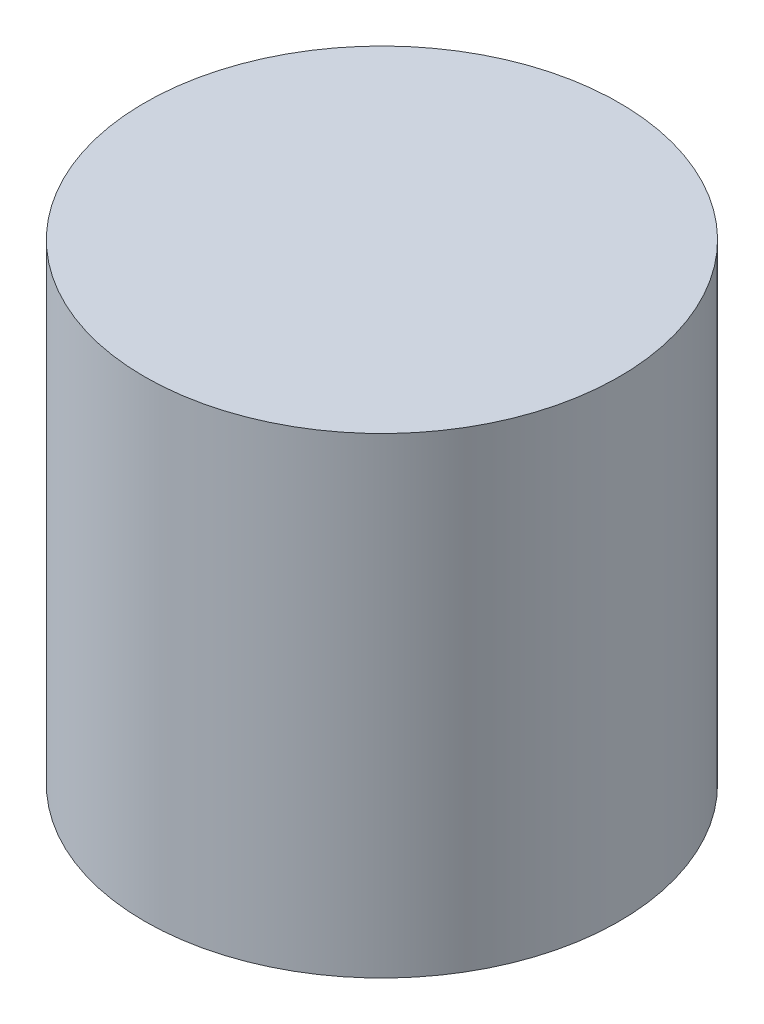
ISO-10303-21;
HEADER;
FILE_DESCRIPTION(('STEP AP214'),'2;1');
FILE_NAME('part.step','',(''),(''),'','','');
FILE_SCHEMA(('AUTOMOTIVE_DESIGN { 1 0 10303 214 1 1 1 1 }'));
ENDSEC;
DATA;
#1=APPLICATION_CONTEXT('core data for automotive mechanical design processes');
#2=APPLICATION_PROTOCOL_DEFINITION('international standard','automotive_design',2000,#1);
#3=PRODUCT_CONTEXT('',#1,'mechanical');
#4=PRODUCT('Part','Part','',(#3));
#5=PRODUCT_RELATED_PRODUCT_CATEGORY('part','',(#4));
#6=PRODUCT_DEFINITION_FORMATION('','',#4);
#7=PRODUCT_DEFINITION_CONTEXT('part definition',#1,'design');
#8=PRODUCT_DEFINITION('design','',#6,#7);
#9=PRODUCT_DEFINITION_SHAPE('','',#8);
#10=(LENGTH_UNIT() NAMED_UNIT(*) SI_UNIT(.MILLI.,.METRE.));
#11=(NAMED_UNIT(*) PLANE_ANGLE_UNIT() SI_UNIT($,.RADIAN.));
#12=(NAMED_UNIT(*) SI_UNIT($,.STERADIAN.) SOLID_ANGLE_UNIT());
#13=UNCERTAINTY_MEASURE_WITH_UNIT(LENGTH_MEASURE(1.E-05),#10,'distance_accuracy_value','');
#14=(GEOMETRIC_REPRESENTATION_CONTEXT(3) GLOBAL_UNCERTAINTY_ASSIGNED_CONTEXT((#13)) GLOBAL_UNIT_ASSIGNED_CONTEXT((#10,
#11,#12)) REPRESENTATION_CONTEXT('',''));
#15=CARTESIAN_POINT('',(0.,0.,0.));
#16=DIRECTION('',(0.,0.,1.));
#17=DIRECTION('',(1.,0.,0.));
#18=AXIS2_PLACEMENT_3D('',#15,#16,#17);
#19=CARTESIAN_POINT('',(0.,7.8232,0.));
#20=DIRECTION('',(0.,-1.,0.));
#21=DIRECTION('',(0.,0.,-1.));
#22=AXIS2_PLACEMENT_3D('',#19,#20,#21);
#23=CYLINDRICAL_SURFACE('',#22,3.937);
#24=CARTESIAN_POINT('',(0.,7.8232,0.));
#25=DIRECTION('',(0.,1.,0.));
#26=DIRECTION('',(0.,0.,1.));
#27=AXIS2_PLACEMENT_3D('',#24,#25,#26);
#28=CIRCLE('',#27,3.937);
#29=CARTESIAN_POINT('',(0.,7.8232,3.937));
#30=VERTEX_POINT('',#29);
#31=EDGE_CURVE('E10',#30,#30,#28,.T.);
#32=ORIENTED_EDGE('',*,*,#31,.F.);
#33=EDGE_LOOP('',(#32));
#34=FACE_BOUND('',#33,.T.);
#35=CARTESIAN_POINT('',(0.,0.,0.));
#36=DIRECTION('',(0.,1.,0.));
#37=DIRECTION('',(0.,0.,1.));
#38=AXIS2_PLACEMENT_3D('',#35,#36,#37);
#39=CIRCLE('',#38,3.937);
#40=CARTESIAN_POINT('',(0.,0.,3.937));
#41=VERTEX_POINT('',#40);
#42=EDGE_CURVE('E35',#41,#41,#39,.T.);
#43=ORIENTED_EDGE('',*,*,#42,.T.);
#44=EDGE_LOOP('',(#43));
#45=FACE_BOUND('',#44,.T.);
#46=ADVANCED_FACE('F32',(#34,#45),#23,.T.);
#47=CARTESIAN_POINT('',(0.,7.8232,0.));
#48=DIRECTION('',(0.,1.,0.));
#49=DIRECTION('',(0.,0.,1.));
#50=AXIS2_PLACEMENT_3D('',#47,#48,#49);
#51=PLANE('',#50);
#52=ORIENTED_EDGE('',*,*,#31,.T.);
#53=EDGE_LOOP('',(#52));
#54=FACE_BOUND('',#53,.T.);
#55=ADVANCED_FACE('F47',(#54),#51,.T.);
#56=CARTESIAN_POINT('',(0.,0.,0.));
#57=DIRECTION('',(0.,1.,0.));
#58=DIRECTION('',(0.,0.,1.));
#59=AXIS2_PLACEMENT_3D('',#56,#57,#58);
#60=PLANE('',#59);
#61=ORIENTED_EDGE('',*,*,#42,.F.);
#62=EDGE_LOOP('',(#61));
#63=FACE_BOUND('',#62,.T.);
#64=ADVANCED_FACE('F45',(#63),#60,.F.);
#65=CLOSED_SHELL('',(#46,#55,#64));
#66=MANIFOLD_SOLID_BREP('B2',#65);
#67=ADVANCED_BREP_SHAPE_REPRESENTATION('',(#18,#66),#14);
#68=SHAPE_DEFINITION_REPRESENTATION(#9,#67);
ENDSEC;
END-ISO-10303-21;
